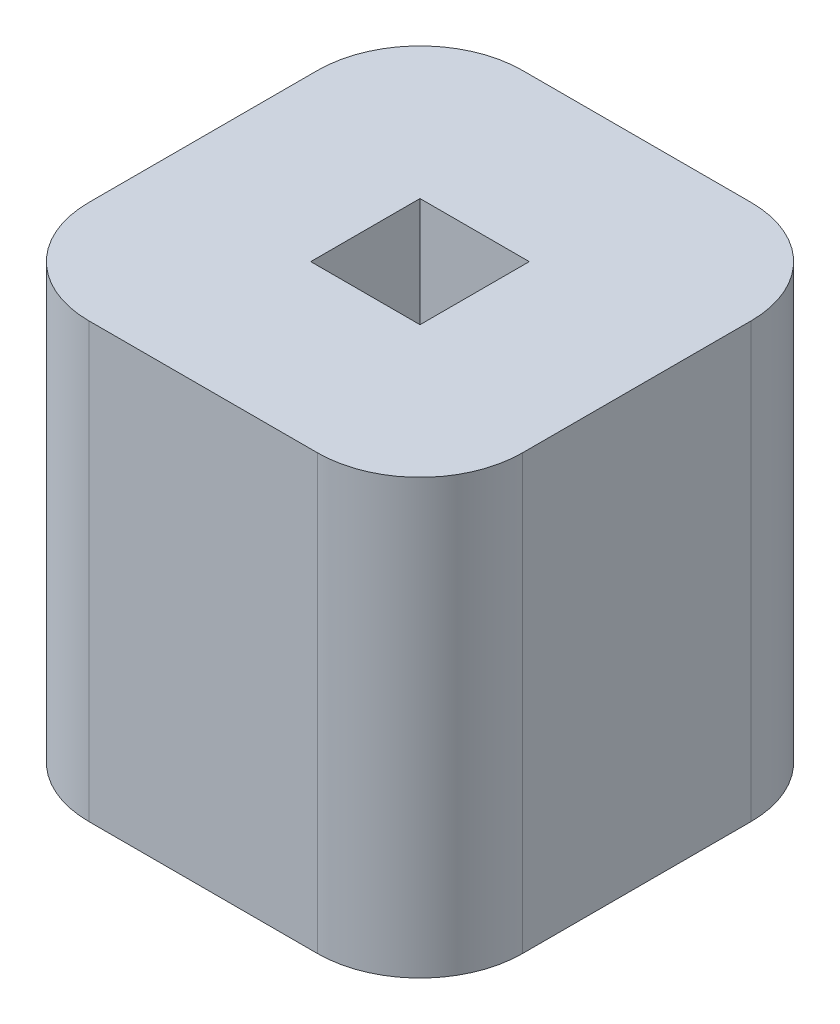
ISO-10303-21;
HEADER;
FILE_DESCRIPTION(('STEP AP214'),'2;1');
FILE_NAME('part.step','',(''),(''),'','','');
FILE_SCHEMA(('AUTOMOTIVE_DESIGN { 1 0 10303 214 1 1 1 1 }'));
ENDSEC;
DATA;
#1=APPLICATION_CONTEXT('core data for automotive mechanical design processes');
#2=APPLICATION_PROTOCOL_DEFINITION('international standard','automotive_design',2000,#1);
#3=PRODUCT_CONTEXT('',#1,'mechanical');
#4=PRODUCT('Part','Part','',(#3));
#5=PRODUCT_RELATED_PRODUCT_CATEGORY('part','',(#4));
#6=PRODUCT_DEFINITION_FORMATION('','',#4);
#7=PRODUCT_DEFINITION_CONTEXT('part definition',#1,'design');
#8=PRODUCT_DEFINITION('design','',#6,#7);
#9=PRODUCT_DEFINITION_SHAPE('','',#8);
#10=(LENGTH_UNIT() NAMED_UNIT(*) SI_UNIT(.MILLI.,.METRE.));
#11=(NAMED_UNIT(*) PLANE_ANGLE_UNIT() SI_UNIT($,.RADIAN.));
#12=(NAMED_UNIT(*) SI_UNIT($,.STERADIAN.) SOLID_ANGLE_UNIT());
#13=UNCERTAINTY_MEASURE_WITH_UNIT(LENGTH_MEASURE(1.E-05),#10,'distance_accuracy_value','');
#14=(GEOMETRIC_REPRESENTATION_CONTEXT(3) GLOBAL_UNCERTAINTY_ASSIGNED_CONTEXT((#13)) GLOBAL_UNIT_ASSIGNED_CONTEXT((#10,
#11,#12)) REPRESENTATION_CONTEXT('',''));
#15=CARTESIAN_POINT('',(0.,0.,0.));
#16=DIRECTION('',(0.,0.,1.));
#17=DIRECTION('',(1.,0.,0.));
#18=AXIS2_PLACEMENT_3D('',#15,#16,#17);
#19=CARTESIAN_POINT('',(-1.05381363281178,2.54,-1.51128201849815));
#20=DIRECTION('',(1.,0.,0.));
#21=DIRECTION('',(0.,0.,-1.));
#22=AXIS2_PLACEMENT_3D('',#19,#20,#21);
#23=PLANE('',#22);
#24=DIRECTION('',(0.,0.,1.));
#25=VECTOR('',#24,1.);
#26=CARTESIAN_POINT('',(-1.05381363281178,0.,-1.51128201849815));
#27=LINE('',#26,#25);
#28=CARTESIAN_POINT('',(-1.05381363281178,0.,-0.91128201849815));
#29=VERTEX_POINT('',#28);
#30=CARTESIAN_POINT('',(-1.05381363281178,0.,0.428717981501851));
#31=VERTEX_POINT('',#30);
#32=EDGE_CURVE('E161',#29,#31,#27,.T.);
#33=ORIENTED_EDGE('',*,*,#32,.T.);
#34=DIRECTION('',(0.,-1.,0.));
#35=VECTOR('',#34,1.);
#36=CARTESIAN_POINT('',(-1.05381363281178,2.54,0.428717981501851));
#37=LINE('',#36,#35);
#38=CARTESIAN_POINT('',(-1.05381363281178,2.54,0.428717981501851));
#39=VERTEX_POINT('',#38);
#40=EDGE_CURVE('E200',#31,#39,#37,.F.);
#41=ORIENTED_EDGE('',*,*,#40,.T.);
#42=DIRECTION('',(0.,0.,1.));
#43=VECTOR('',#42,1.);
#44=CARTESIAN_POINT('',(-1.05381363281178,2.54,-1.51128201849815));
#45=LINE('',#44,#43);
#46=CARTESIAN_POINT('',(-1.05381363281178,2.54,-0.91128201849815));
#47=VERTEX_POINT('',#46);
#48=EDGE_CURVE('E165',#47,#39,#45,.T.);
#49=ORIENTED_EDGE('',*,*,#48,.F.);
#50=DIRECTION('',(0.,-1.,0.));
#51=VECTOR('',#50,1.);
#52=CARTESIAN_POINT('',(-1.05381363281178,2.54,-0.91128201849815));
#53=LINE('',#52,#51);
#54=EDGE_CURVE('E176',#47,#29,#53,.T.);
#55=ORIENTED_EDGE('',*,*,#54,.T.);
#56=EDGE_LOOP('',(#33,#41,#49,#55));
#57=FACE_BOUND('',#56,.T.);
#58=ADVANCED_FACE('F33',(#57),#23,.F.);
#59=CARTESIAN_POINT('',(-1.05381363281178,2.54,1.02871798150185));
#60=DIRECTION('',(0.,0.,-1.));
#61=DIRECTION('',(-1.,0.,0.));
#62=AXIS2_PLACEMENT_3D('',#59,#60,#61);
#63=PLANE('',#62);
#64=DIRECTION('',(1.,0.,0.));
#65=VECTOR('',#64,1.);
#66=CARTESIAN_POINT('',(-1.05381363281178,0.,1.02871798150185));
#67=LINE('',#66,#65);
#68=CARTESIAN_POINT('',(-0.453813632811776,0.,1.02871798150185));
#69=VERTEX_POINT('',#68);
#70=CARTESIAN_POINT('',(0.886186367188225,0.,1.02871798150185));
#71=VERTEX_POINT('',#70);
#72=EDGE_CURVE('E179',#69,#71,#67,.T.);
#73=ORIENTED_EDGE('',*,*,#72,.T.);
#74=DIRECTION('',(0.,-1.,0.));
#75=VECTOR('',#74,1.);
#76=CARTESIAN_POINT('',(0.886186367188225,2.54,1.02871798150185));
#77=LINE('',#76,#75);
#78=CARTESIAN_POINT('',(0.886186367188225,2.54,1.02871798150185));
#79=VERTEX_POINT('',#78);
#80=EDGE_CURVE('E209',#71,#79,#77,.F.);
#81=ORIENTED_EDGE('',*,*,#80,.T.);
#82=DIRECTION('',(1.,0.,0.));
#83=VECTOR('',#82,1.);
#84=CARTESIAN_POINT('',(-1.05381363281178,2.54,1.02871798150185));
#85=LINE('',#84,#83);
#86=CARTESIAN_POINT('',(-0.453813632811776,2.54,1.02871798150185));
#87=VERTEX_POINT('',#86);
#88=EDGE_CURVE('E168',#87,#79,#85,.T.);
#89=ORIENTED_EDGE('',*,*,#88,.F.);
#90=DIRECTION('',(0.,-1.,0.));
#91=VECTOR('',#90,1.);
#92=CARTESIAN_POINT('',(-0.453813632811776,2.54,1.02871798150185));
#93=LINE('',#92,#91);
#94=EDGE_CURVE('E195',#87,#69,#93,.T.);
#95=ORIENTED_EDGE('',*,*,#94,.T.);
#96=EDGE_LOOP('',(#73,#81,#89,#95));
#97=FACE_BOUND('',#96,.T.);
#98=ADVANCED_FACE('F240',(#97),#63,.F.);
#99=CARTESIAN_POINT('',(1.48618636718822,2.54,-1.51128201849815));
#100=DIRECTION('',(-1.,0.,0.));
#101=DIRECTION('',(0.,0.,1.));
#102=AXIS2_PLACEMENT_3D('',#99,#100,#101);
#103=PLANE('',#102);
#104=DIRECTION('',(0.,0.,-1.));
#105=VECTOR('',#104,1.);
#106=CARTESIAN_POINT('',(1.48618636718822,0.,-1.51128201849815));
#107=LINE('',#106,#105);
#108=CARTESIAN_POINT('',(1.48618636718822,0.,0.428717981501851));
#109=VERTEX_POINT('',#108);
#110=CARTESIAN_POINT('',(1.48618636718822,0.,-0.91128201849815));
#111=VERTEX_POINT('',#110);
#112=EDGE_CURVE('E182',#109,#111,#107,.T.);
#113=ORIENTED_EDGE('',*,*,#112,.T.);
#114=DIRECTION('',(0.,-1.,0.));
#115=VECTOR('',#114,1.);
#116=CARTESIAN_POINT('',(1.48618636718822,2.54,-0.91128201849815));
#117=LINE('',#116,#115);
#118=CARTESIAN_POINT('',(1.48618636718822,2.54,-0.91128201849815));
#119=VERTEX_POINT('',#118);
#120=EDGE_CURVE('E41',#111,#119,#117,.F.);
#121=ORIENTED_EDGE('',*,*,#120,.T.);
#122=DIRECTION('',(0.,0.,-1.));
#123=VECTOR('',#122,1.);
#124=CARTESIAN_POINT('',(1.48618636718822,2.54,-1.51128201849815));
#125=LINE('',#124,#123);
#126=CARTESIAN_POINT('',(1.48618636718822,2.54,0.428717981501851));
#127=VERTEX_POINT('',#126);
#128=EDGE_CURVE('E172',#127,#119,#125,.T.);
#129=ORIENTED_EDGE('',*,*,#128,.F.);
#130=DIRECTION('',(0.,-1.,0.));
#131=VECTOR('',#130,1.);
#132=CARTESIAN_POINT('',(1.48618636718822,2.54,0.428717981501851));
#133=LINE('',#132,#131);
#134=EDGE_CURVE('E204',#127,#109,#133,.T.);
#135=ORIENTED_EDGE('',*,*,#134,.T.);
#136=EDGE_LOOP('',(#113,#121,#129,#135));
#137=FACE_BOUND('',#136,.T.);
#138=ADVANCED_FACE('F246',(#137),#103,.F.);
#139=CARTESIAN_POINT('',(-1.05381363281178,2.54,-1.51128201849815));
#140=DIRECTION('',(0.,0.,1.));
#141=DIRECTION('',(1.,0.,0.));
#142=AXIS2_PLACEMENT_3D('',#139,#140,#141);
#143=PLANE('',#142);
#144=DIRECTION('',(-1.,0.,0.));
#145=VECTOR('',#144,1.);
#146=CARTESIAN_POINT('',(-1.05381363281178,2.54,-1.51128201849815));
#147=LINE('',#146,#145);
#148=CARTESIAN_POINT('',(0.886186367188225,2.54,-1.51128201849815));
#149=VERTEX_POINT('',#148);
#150=CARTESIAN_POINT('',(-0.453813632811776,2.54,-1.51128201849815));
#151=VERTEX_POINT('',#150);
#152=EDGE_CURVE('E174',#149,#151,#147,.T.);
#153=ORIENTED_EDGE('',*,*,#152,.F.);
#154=DIRECTION('',(0.,-1.,0.));
#155=VECTOR('',#154,1.);
#156=CARTESIAN_POINT('',(0.886186367188225,2.54,-1.51128201849815));
#157=LINE('',#156,#155);
#158=CARTESIAN_POINT('',(0.886186367188225,0.,-1.51128201849815));
#159=VERTEX_POINT('',#158);
#160=EDGE_CURVE('E213',#149,#159,#157,.T.);
#161=ORIENTED_EDGE('',*,*,#160,.T.);
#162=DIRECTION('',(-1.,0.,0.));
#163=VECTOR('',#162,1.);
#164=CARTESIAN_POINT('',(-1.05381363281178,0.,-1.51128201849815));
#165=LINE('',#164,#163);
#166=CARTESIAN_POINT('',(-0.453813632811776,0.,-1.51128201849815));
#167=VERTEX_POINT('',#166);
#168=EDGE_CURVE('E169',#159,#167,#165,.T.);
#169=ORIENTED_EDGE('',*,*,#168,.T.);
#170=DIRECTION('',(0.,-1.,0.));
#171=VECTOR('',#170,1.);
#172=CARTESIAN_POINT('',(-0.453813632811776,2.54,-1.51128201849815));
#173=LINE('',#172,#171);
#174=EDGE_CURVE('E190',#167,#151,#173,.F.);
#175=ORIENTED_EDGE('',*,*,#174,.T.);
#176=EDGE_LOOP('',(#153,#161,#169,#175));
#177=FACE_BOUND('',#176,.T.);
#178=ADVANCED_FACE('F219',(#177),#143,.F.);
#179=CARTESIAN_POINT('',(0.,2.54,0.));
#180=DIRECTION('',(0.,1.,0.));
#181=DIRECTION('',(0.,0.,1.));
#182=AXIS2_PLACEMENT_3D('',#179,#180,#181);
#183=PLANE('',#182);
#184=DIRECTION('',(0.,0.,-1.));
#185=VECTOR('',#184,1.);
#186=CARTESIAN_POINT('',(0.536186367188225,2.54,0.0787179815018502));
#187=LINE('',#186,#185);
#188=CARTESIAN_POINT('',(0.536186367188225,2.54,0.0787179815018502));
#189=VERTEX_POINT('',#188);
#190=CARTESIAN_POINT('',(0.536186367188225,2.54,-0.56128201849815));
#191=VERTEX_POINT('',#190);
#192=EDGE_CURVE('E129',#189,#191,#187,.T.);
#193=ORIENTED_EDGE('',*,*,#192,.F.);
#194=DIRECTION('',(1.,0.,0.));
#195=VECTOR('',#194,1.);
#196=CARTESIAN_POINT('',(-0.103813632811776,2.54,0.0787179815018502));
#197=LINE('',#196,#195);
#198=CARTESIAN_POINT('',(-0.103813632811776,2.54,0.0787179815018502));
#199=VERTEX_POINT('',#198);
#200=EDGE_CURVE('E146',#199,#189,#197,.T.);
#201=ORIENTED_EDGE('',*,*,#200,.F.);
#202=DIRECTION('',(0.,0.,1.));
#203=VECTOR('',#202,1.);
#204=CARTESIAN_POINT('',(-0.103813632811776,2.54,0.0787179815018502));
#205=LINE('',#204,#203);
#206=CARTESIAN_POINT('',(-0.103813632811776,2.54,-0.56128201849815));
#207=VERTEX_POINT('',#206);
#208=EDGE_CURVE('E149',#207,#199,#205,.T.);
#209=ORIENTED_EDGE('',*,*,#208,.F.);
#210=DIRECTION('',(-1.,0.,0.));
#211=VECTOR('',#210,1.);
#212=CARTESIAN_POINT('',(-0.103813632811776,2.54,-0.56128201849815));
#213=LINE('',#212,#211);
#214=EDGE_CURVE('E155',#191,#207,#213,.T.);
#215=ORIENTED_EDGE('',*,*,#214,.F.);
#216=EDGE_LOOP('',(#193,#201,#209,#215));
#217=FACE_BOUND('',#216,.T.);
#218=ORIENTED_EDGE('',*,*,#128,.T.);
#219=CARTESIAN_POINT('',(0.886186367188225,2.54,-0.91128201849815));
#220=DIRECTION('',(0.,1.,0.));
#221=DIRECTION('',(0.,0.,1.));
#222=AXIS2_PLACEMENT_3D('',#219,#220,#221);
#223=CIRCLE('',#222,0.6);
#224=EDGE_CURVE('E11',#119,#149,#223,.T.);
#225=ORIENTED_EDGE('',*,*,#224,.T.);
#226=ORIENTED_EDGE('',*,*,#152,.T.);
#227=CARTESIAN_POINT('',(-0.453813632811776,2.54,-0.91128201849815));
#228=DIRECTION('',(0.,1.,0.));
#229=DIRECTION('',(0.,0.,1.));
#230=AXIS2_PLACEMENT_3D('',#227,#228,#229);
#231=CIRCLE('',#230,0.6);
#232=EDGE_CURVE('E193',#151,#47,#231,.T.);
#233=ORIENTED_EDGE('',*,*,#232,.T.);
#234=ORIENTED_EDGE('',*,*,#48,.T.);
#235=CARTESIAN_POINT('',(-0.453813632811776,2.54,0.428717981501851));
#236=DIRECTION('',(0.,1.,0.));
#237=DIRECTION('',(0.,0.,1.));
#238=AXIS2_PLACEMENT_3D('',#235,#236,#237);
#239=CIRCLE('',#238,0.6);
#240=EDGE_CURVE('E202',#39,#87,#239,.T.);
#241=ORIENTED_EDGE('',*,*,#240,.T.);
#242=ORIENTED_EDGE('',*,*,#88,.T.);
#243=CARTESIAN_POINT('',(0.886186367188225,2.54,0.428717981501851));
#244=DIRECTION('',(0.,1.,0.));
#245=DIRECTION('',(0.,0.,1.));
#246=AXIS2_PLACEMENT_3D('',#243,#244,#245);
#247=CIRCLE('',#246,0.6);
#248=EDGE_CURVE('E211',#79,#127,#247,.T.);
#249=ORIENTED_EDGE('',*,*,#248,.T.);
#250=EDGE_LOOP('',(#218,#225,#226,#233,#234,#241,#242,#249));
#251=FACE_BOUND('',#250,.T.);
#252=ADVANCED_FACE('F230',(#217,#251),#183,.T.);
#253=CARTESIAN_POINT('',(0.,0.,0.));
#254=DIRECTION('',(0.,1.,0.));
#255=DIRECTION('',(0.,0.,1.));
#256=AXIS2_PLACEMENT_3D('',#253,#254,#255);
#257=PLANE('',#256);
#258=DIRECTION('',(1.,0.,0.));
#259=VECTOR('',#258,1.);
#260=CARTESIAN_POINT('',(-0.103813632811776,0.,0.0787179815018502));
#261=LINE('',#260,#259);
#262=CARTESIAN_POINT('',(-0.103813632811776,0.,0.0787179815018502));
#263=VERTEX_POINT('',#262);
#264=CARTESIAN_POINT('',(0.536186367188225,0.,0.0787179815018502));
#265=VERTEX_POINT('',#264);
#266=EDGE_CURVE('E134',#263,#265,#261,.T.);
#267=ORIENTED_EDGE('',*,*,#266,.T.);
#268=DIRECTION('',(0.,0.,-1.));
#269=VECTOR('',#268,1.);
#270=CARTESIAN_POINT('',(0.536186367188225,0.,0.0787179815018502));
#271=LINE('',#270,#269);
#272=CARTESIAN_POINT('',(0.536186367188225,0.,-0.56128201849815));
#273=VERTEX_POINT('',#272);
#274=EDGE_CURVE('E126',#265,#273,#271,.T.);
#275=ORIENTED_EDGE('',*,*,#274,.T.);
#276=DIRECTION('',(-1.,0.,0.));
#277=VECTOR('',#276,1.);
#278=CARTESIAN_POINT('',(-0.103813632811776,0.,-0.56128201849815));
#279=LINE('',#278,#277);
#280=CARTESIAN_POINT('',(-0.103813632811776,0.,-0.56128201849815));
#281=VERTEX_POINT('',#280);
#282=EDGE_CURVE('E138',#273,#281,#279,.T.);
#283=ORIENTED_EDGE('',*,*,#282,.T.);
#284=DIRECTION('',(0.,0.,1.));
#285=VECTOR('',#284,1.);
#286=CARTESIAN_POINT('',(-0.103813632811776,0.,0.0787179815018502));
#287=LINE('',#286,#285);
#288=EDGE_CURVE('E142',#281,#263,#287,.T.);
#289=ORIENTED_EDGE('',*,*,#288,.T.);
#290=EDGE_LOOP('',(#267,#275,#283,#289));
#291=FACE_BOUND('',#290,.T.);
#292=ORIENTED_EDGE('',*,*,#168,.F.);
#293=CARTESIAN_POINT('',(0.886186367188225,0.,-0.91128201849815));
#294=DIRECTION('',(0.,1.,0.));
#295=DIRECTION('',(0.,0.,1.));
#296=AXIS2_PLACEMENT_3D('',#293,#294,#295);
#297=CIRCLE('',#296,0.6);
#298=EDGE_CURVE('E55',#159,#111,#297,.F.);
#299=ORIENTED_EDGE('',*,*,#298,.T.);
#300=ORIENTED_EDGE('',*,*,#112,.F.);
#301=CARTESIAN_POINT('',(0.886186367188225,0.,0.428717981501851));
#302=DIRECTION('',(0.,1.,0.));
#303=DIRECTION('',(0.,0.,1.));
#304=AXIS2_PLACEMENT_3D('',#301,#302,#303);
#305=CIRCLE('',#304,0.6);
#306=EDGE_CURVE('E207',#109,#71,#305,.F.);
#307=ORIENTED_EDGE('',*,*,#306,.T.);
#308=ORIENTED_EDGE('',*,*,#72,.F.);
#309=CARTESIAN_POINT('',(-0.453813632811776,0.,0.428717981501851));
#310=DIRECTION('',(0.,1.,0.));
#311=DIRECTION('',(0.,0.,1.));
#312=AXIS2_PLACEMENT_3D('',#309,#310,#311);
#313=CIRCLE('',#312,0.6);
#314=EDGE_CURVE('E198',#69,#31,#313,.F.);
#315=ORIENTED_EDGE('',*,*,#314,.T.);
#316=ORIENTED_EDGE('',*,*,#32,.F.);
#317=CARTESIAN_POINT('',(-0.453813632811776,0.,-0.91128201849815));
#318=DIRECTION('',(0.,1.,0.));
#319=DIRECTION('',(0.,0.,1.));
#320=AXIS2_PLACEMENT_3D('',#317,#318,#319);
#321=CIRCLE('',#320,0.6);
#322=EDGE_CURVE('E187',#29,#167,#321,.F.);
#323=ORIENTED_EDGE('',*,*,#322,.T.);
#324=EDGE_LOOP('',(#292,#299,#300,#307,#308,#315,#316,#323));
#325=FACE_BOUND('',#324,.T.);
#326=ADVANCED_FACE('F144',(#291,#325),#257,.F.);
#327=CARTESIAN_POINT('',(0.536186367188225,0.,0.0787179815018502));
#328=DIRECTION('',(1.,0.,0.));
#329=DIRECTION('',(0.,0.,-1.));
#330=AXIS2_PLACEMENT_3D('',#327,#328,#329);
#331=PLANE('',#330);
#332=ORIENTED_EDGE('',*,*,#192,.T.);
#333=DIRECTION('',(0.,1.,0.));
#334=VECTOR('',#333,1.);
#335=CARTESIAN_POINT('',(0.536186367188225,0.,-0.56128201849815));
#336=LINE('',#335,#334);
#337=EDGE_CURVE('E122',#273,#191,#336,.T.);
#338=ORIENTED_EDGE('',*,*,#337,.F.);
#339=ORIENTED_EDGE('',*,*,#274,.F.);
#340=DIRECTION('',(0.,1.,0.));
#341=VECTOR('',#340,1.);
#342=CARTESIAN_POINT('',(0.536186367188225,0.,0.0787179815018502));
#343=LINE('',#342,#341);
#344=EDGE_CURVE('E159',#265,#189,#343,.T.);
#345=ORIENTED_EDGE('',*,*,#344,.T.);
#346=EDGE_LOOP('',(#332,#338,#339,#345));
#347=FACE_BOUND('',#346,.T.);
#348=ADVANCED_FACE('F124',(#347),#331,.F.);
#349=CARTESIAN_POINT('',(-0.103813632811776,0.,0.0787179815018502));
#350=DIRECTION('',(0.,0.,1.));
#351=DIRECTION('',(1.,0.,0.));
#352=AXIS2_PLACEMENT_3D('',#349,#350,#351);
#353=PLANE('',#352);
#354=ORIENTED_EDGE('',*,*,#200,.T.);
#355=ORIENTED_EDGE('',*,*,#344,.F.);
#356=ORIENTED_EDGE('',*,*,#266,.F.);
#357=DIRECTION('',(0.,1.,0.));
#358=VECTOR('',#357,1.);
#359=CARTESIAN_POINT('',(-0.103813632811776,0.,0.0787179815018502));
#360=LINE('',#359,#358);
#361=EDGE_CURVE('E162',#263,#199,#360,.T.);
#362=ORIENTED_EDGE('',*,*,#361,.T.);
#363=EDGE_LOOP('',(#354,#355,#356,#362));
#364=FACE_BOUND('',#363,.T.);
#365=ADVANCED_FACE('F319',(#364),#353,.F.);
#366=CARTESIAN_POINT('',(-0.103813632811776,0.,0.0787179815018502));
#367=DIRECTION('',(-1.,0.,0.));
#368=DIRECTION('',(0.,0.,1.));
#369=AXIS2_PLACEMENT_3D('',#366,#367,#368);
#370=PLANE('',#369);
#371=ORIENTED_EDGE('',*,*,#208,.T.);
#372=ORIENTED_EDGE('',*,*,#361,.F.);
#373=ORIENTED_EDGE('',*,*,#288,.F.);
#374=DIRECTION('',(0.,1.,0.));
#375=VECTOR('',#374,1.);
#376=CARTESIAN_POINT('',(-0.103813632811776,0.,-0.56128201849815));
#377=LINE('',#376,#375);
#378=EDGE_CURVE('E133',#281,#207,#377,.T.);
#379=ORIENTED_EDGE('',*,*,#378,.T.);
#380=EDGE_LOOP('',(#371,#372,#373,#379));
#381=FACE_BOUND('',#380,.T.);
#382=ADVANCED_FACE('F325',(#381),#370,.F.);
#383=CARTESIAN_POINT('',(-0.103813632811776,0.,-0.56128201849815));
#384=DIRECTION('',(0.,0.,-1.));
#385=DIRECTION('',(-1.,0.,0.));
#386=AXIS2_PLACEMENT_3D('',#383,#384,#385);
#387=PLANE('',#386);
#388=ORIENTED_EDGE('',*,*,#214,.T.);
#389=ORIENTED_EDGE('',*,*,#378,.F.);
#390=ORIENTED_EDGE('',*,*,#282,.F.);
#391=ORIENTED_EDGE('',*,*,#337,.T.);
#392=EDGE_LOOP('',(#388,#389,#390,#391));
#393=FACE_BOUND('',#392,.T.);
#394=ADVANCED_FACE('F139',(#393),#387,.F.);
#395=CARTESIAN_POINT('',(-0.453813632811776,2.54,-0.91128201849815));
#396=DIRECTION('',(0.,-1.,0.));
#397=DIRECTION('',(0.,0.,-1.));
#398=AXIS2_PLACEMENT_3D('',#395,#396,#397);
#399=CYLINDRICAL_SURFACE('',#398,0.6);
#400=ORIENTED_EDGE('',*,*,#232,.F.);
#401=ORIENTED_EDGE('',*,*,#174,.F.);
#402=ORIENTED_EDGE('',*,*,#322,.F.);
#403=ORIENTED_EDGE('',*,*,#54,.F.);
#404=EDGE_LOOP('',(#400,#401,#402,#403));
#405=FACE_BOUND('',#404,.T.);
#406=ADVANCED_FACE('F227',(#405),#399,.T.);
#407=CARTESIAN_POINT('',(-0.453813632811776,2.54,0.428717981501851));
#408=DIRECTION('',(0.,-1.,0.));
#409=DIRECTION('',(0.,0.,-1.));
#410=AXIS2_PLACEMENT_3D('',#407,#408,#409);
#411=CYLINDRICAL_SURFACE('',#410,0.6);
#412=ORIENTED_EDGE('',*,*,#240,.F.);
#413=ORIENTED_EDGE('',*,*,#40,.F.);
#414=ORIENTED_EDGE('',*,*,#314,.F.);
#415=ORIENTED_EDGE('',*,*,#94,.F.);
#416=EDGE_LOOP('',(#412,#413,#414,#415));
#417=FACE_BOUND('',#416,.T.);
#418=ADVANCED_FACE('F235',(#417),#411,.T.);
#419=CARTESIAN_POINT('',(0.886186367188225,2.54,0.428717981501851));
#420=DIRECTION('',(0.,-1.,0.));
#421=DIRECTION('',(0.,0.,-1.));
#422=AXIS2_PLACEMENT_3D('',#419,#420,#421);
#423=CYLINDRICAL_SURFACE('',#422,0.6);
#424=ORIENTED_EDGE('',*,*,#248,.F.);
#425=ORIENTED_EDGE('',*,*,#80,.F.);
#426=ORIENTED_EDGE('',*,*,#306,.F.);
#427=ORIENTED_EDGE('',*,*,#134,.F.);
#428=EDGE_LOOP('',(#424,#425,#426,#427));
#429=FACE_BOUND('',#428,.T.);
#430=ADVANCED_FACE('F244',(#429),#423,.T.);
#431=CARTESIAN_POINT('',(0.886186367188225,2.54,-0.91128201849815));
#432=DIRECTION('',(0.,-1.,0.));
#433=DIRECTION('',(0.,0.,-1.));
#434=AXIS2_PLACEMENT_3D('',#431,#432,#433);
#435=CYLINDRICAL_SURFACE('',#434,0.6);
#436=ORIENTED_EDGE('',*,*,#224,.F.);
#437=ORIENTED_EDGE('',*,*,#120,.F.);
#438=ORIENTED_EDGE('',*,*,#298,.F.);
#439=ORIENTED_EDGE('',*,*,#160,.F.);
#440=EDGE_LOOP('',(#436,#437,#438,#439));
#441=FACE_BOUND('',#440,.T.);
#442=ADVANCED_FACE('F35',(#441),#435,.T.);
#443=CLOSED_SHELL('',(#58,#98,#138,#178,#252,#326,#348,#365,#382,#394,#406,#418,#430,#442));
#444=MANIFOLD_SOLID_BREP('B2',#443);
#445=ADVANCED_BREP_SHAPE_REPRESENTATION('',(#18,#444),#14);
#446=SHAPE_DEFINITION_REPRESENTATION(#9,#445);
ENDSEC;
END-ISO-10303-21;
